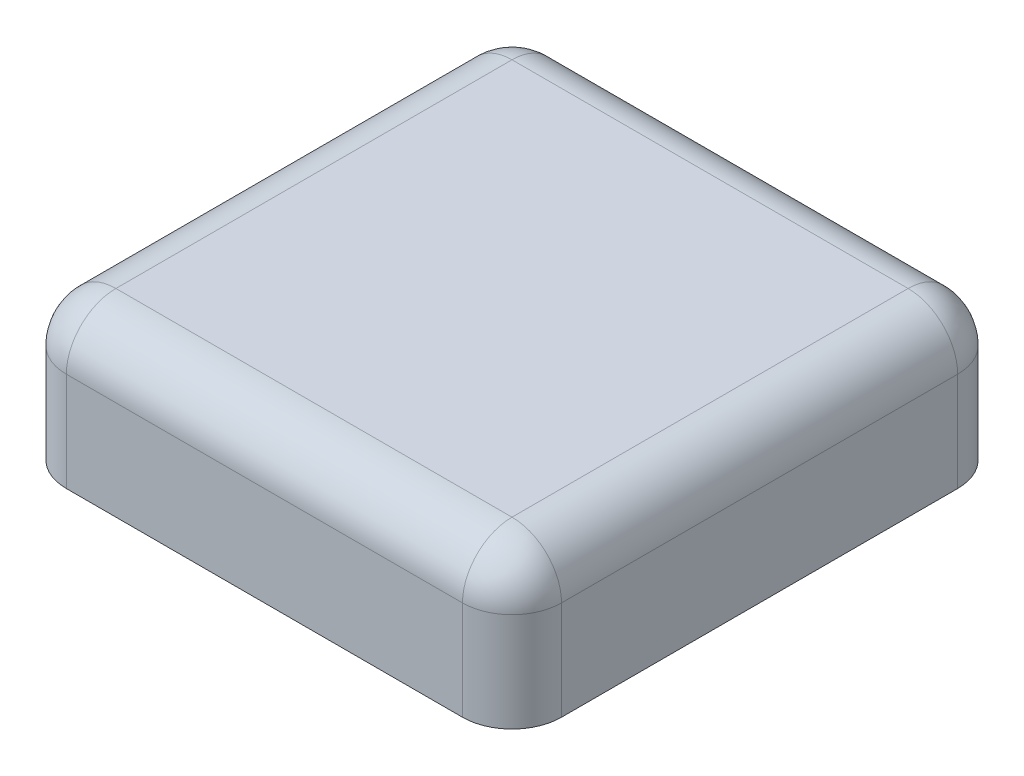
ISO-10303-21;
HEADER;
FILE_DESCRIPTION(('STEP AP214'),'2;1');
FILE_NAME('part.step','',(''),(''),'','','');
FILE_SCHEMA(('AUTOMOTIVE_DESIGN { 1 0 10303 214 1 1 1 1 }'));
ENDSEC;
DATA;
#1=APPLICATION_CONTEXT('core data for automotive mechanical design processes');
#2=APPLICATION_PROTOCOL_DEFINITION('international standard','automotive_design',2000,#1);
#3=PRODUCT_CONTEXT('',#1,'mechanical');
#4=PRODUCT('Part','Part','',(#3));
#5=PRODUCT_RELATED_PRODUCT_CATEGORY('part','',(#4));
#6=PRODUCT_DEFINITION_FORMATION('','',#4);
#7=PRODUCT_DEFINITION_CONTEXT('part definition',#1,'design');
#8=PRODUCT_DEFINITION('design','',#6,#7);
#9=PRODUCT_DEFINITION_SHAPE('','',#8);
#10=(LENGTH_UNIT() NAMED_UNIT(*) SI_UNIT(.MILLI.,.METRE.));
#11=(NAMED_UNIT(*) PLANE_ANGLE_UNIT() SI_UNIT($,.RADIAN.));
#12=(NAMED_UNIT(*) SI_UNIT($,.STERADIAN.) SOLID_ANGLE_UNIT());
#13=UNCERTAINTY_MEASURE_WITH_UNIT(LENGTH_MEASURE(1.E-05),#10,'distance_accuracy_value','');
#14=(GEOMETRIC_REPRESENTATION_CONTEXT(3) GLOBAL_UNCERTAINTY_ASSIGNED_CONTEXT((#13)) GLOBAL_UNIT_ASSIGNED_CONTEXT((#10,
#11,#12)) REPRESENTATION_CONTEXT('',''));
#15=CARTESIAN_POINT('',(0.,0.,0.));
#16=DIRECTION('',(0.,0.,1.));
#17=DIRECTION('',(1.,0.,0.));
#18=AXIS2_PLACEMENT_3D('',#15,#16,#17);
#19=CARTESIAN_POINT('',(122.19479133197,24.35696661282,0.45));
#20=DIRECTION('',(1.,4.371138828674E-08,0.));
#21=DIRECTION('',(-4.371138828674E-08,1.,0.));
#22=AXIS2_PLACEMENT_3D('',#19,#20,#21);
#23=SPHERICAL_SURFACE('',#22,0.05);
#24=CARTESIAN_POINT('',(122.19479133197,24.35696661282,0.45));
#25=DIRECTION('',(0.,0.,-1.));
#26=DIRECTION('',(-4.371138828674E-08,1.,0.));
#27=AXIS2_PLACEMENT_3D('',#24,#25,#26);
#28=CIRCLE('',#27,0.05);
#29=CARTESIAN_POINT('',(122.14479133197,24.356966610635,0.45));
#30=VERTEX_POINT('',#29);
#31=CARTESIAN_POINT('',(122.19479132978,24.40696661282,0.45));
#32=VERTEX_POINT('',#31);
#33=EDGE_CURVE('E11',#30,#32,#28,.T.);
#34=ORIENTED_EDGE('',*,*,#33,.F.);
#35=CARTESIAN_POINT('',(122.19479133197,24.35696661282,0.45));
#36=DIRECTION('',(-4.371138828674E-08,1.,0.));
#37=DIRECTION('',(0.,0.,1.));
#38=AXIS2_PLACEMENT_3D('',#35,#36,#37);
#39=CIRCLE('',#38,0.05);
#40=CARTESIAN_POINT('',(122.19479133197,24.35696661282,0.5));
#41=VERTEX_POINT('',#40);
#42=EDGE_CURVE('E196',#30,#41,#39,.T.);
#43=ORIENTED_EDGE('',*,*,#42,.T.);
#44=CARTESIAN_POINT('',(122.19479133197,24.35696661282,0.45));
#45=DIRECTION('',(1.,4.371138828674E-08,0.));
#46=DIRECTION('',(-4.371138828674E-08,1.,0.));
#47=AXIS2_PLACEMENT_3D('',#44,#45,#46);
#48=CIRCLE('',#47,0.05);
#49=EDGE_CURVE('E257',#32,#41,#48,.T.);
#50=ORIENTED_EDGE('',*,*,#49,.F.);
#51=EDGE_LOOP('',(#34,#43,#50));
#52=FACE_BOUND('',#51,.T.);
#53=ADVANCED_FACE('F16',(#52),#23,.T.);
#54=CARTESIAN_POINT('',(122.19479133197,24.35696661282,0.05));
#55=DIRECTION('',(0.,0.,1.));
#56=DIRECTION('',(-4.371138828674E-08,1.,0.));
#57=AXIS2_PLACEMENT_3D('',#54,#55,#56);
#58=SPHERICAL_SURFACE('',#57,0.05);
#59=CARTESIAN_POINT('',(122.19479133197,24.35696661282,0.05));
#60=DIRECTION('',(1.,4.371138828674E-08,0.));
#61=DIRECTION('',(-4.371138828674E-08,1.,0.));
#62=AXIS2_PLACEMENT_3D('',#59,#60,#61);
#63=CIRCLE('',#62,0.05);
#64=CARTESIAN_POINT('',(122.19479133197,24.35696661282,0.));
#65=VERTEX_POINT('',#64);
#66=CARTESIAN_POINT('',(122.19479132978,24.40696661282,0.05));
#67=VERTEX_POINT('',#66);
#68=EDGE_CURVE('E216',#65,#67,#63,.T.);
#69=ORIENTED_EDGE('',*,*,#68,.F.);
#70=CARTESIAN_POINT('',(122.19479133197,24.35696661282,0.05));
#71=DIRECTION('',(-4.371138822551E-08,1.,0.));
#72=DIRECTION('',(-1.,-4.371138822551E-08,0.));
#73=AXIS2_PLACEMENT_3D('',#70,#71,#72);
#74=CIRCLE('',#73,0.05);
#75=CARTESIAN_POINT('',(122.14479133197,24.356966610635,0.05));
#76=VERTEX_POINT('',#75);
#77=EDGE_CURVE('E20',#65,#76,#74,.T.);
#78=ORIENTED_EDGE('',*,*,#77,.T.);
#79=CARTESIAN_POINT('',(122.19479133197,24.35696661282,0.05));
#80=DIRECTION('',(0.,0.,1.));
#81=DIRECTION('',(-4.371138828674E-08,1.,0.));
#82=AXIS2_PLACEMENT_3D('',#79,#80,#81);
#83=CIRCLE('',#82,0.05);
#84=EDGE_CURVE('E27',#67,#76,#83,.T.);
#85=ORIENTED_EDGE('',*,*,#84,.F.);
#86=EDGE_LOOP('',(#69,#78,#85));
#87=FACE_BOUND('',#86,.T.);
#88=ADVANCED_FACE('F298',(#87),#58,.T.);
#89=CARTESIAN_POINT('',(122.19479133197,24.35696661282,0.));
#90=DIRECTION('',(0.,0.,1.));
#91=DIRECTION('',(-4.371138828674E-08,1.,0.));
#92=AXIS2_PLACEMENT_3D('',#89,#90,#91);
#93=CYLINDRICAL_SURFACE('',#92,0.05);
#94=DIRECTION('',(0.,0.,1.));
#95=VECTOR('',#94,1.);
#96=CARTESIAN_POINT('',(122.19479132978,24.40696661282,0.));
#97=LINE('',#96,#95);
#98=EDGE_CURVE('E178',#67,#32,#97,.T.);
#99=ORIENTED_EDGE('',*,*,#98,.F.);
#100=ORIENTED_EDGE('',*,*,#84,.T.);
#101=DIRECTION('',(0.,0.,1.));
#102=VECTOR('',#101,1.);
#103=CARTESIAN_POINT('',(122.14479133197,24.356966610635,0.));
#104=LINE('',#103,#102);
#105=EDGE_CURVE('E204',#76,#30,#104,.T.);
#106=ORIENTED_EDGE('',*,*,#105,.T.);
#107=ORIENTED_EDGE('',*,*,#33,.T.);
#108=EDGE_LOOP('',(#99,#100,#106,#107));
#109=FACE_BOUND('',#108,.T.);
#110=ADVANCED_FACE('F313',(#109),#93,.T.);
#111=CARTESIAN_POINT('',(122.64479133197,24.35696663249,0.45));
#112=DIRECTION('',(-1.,-4.371138828674E-08,0.));
#113=DIRECTION('',(-4.371138828674E-08,1.,0.));
#114=AXIS2_PLACEMENT_3D('',#111,#112,#113);
#115=CYLINDRICAL_SURFACE('',#114,0.05);
#116=DIRECTION('',(-1.,-4.371138828674E-08,0.));
#117=VECTOR('',#116,1.);
#118=CARTESIAN_POINT('',(122.64479132978,24.40696663249,0.45));
#119=LINE('',#118,#117);
#120=CARTESIAN_POINT('',(122.59479132978,24.406966630305,0.45));
#121=VERTEX_POINT('',#120);
#122=EDGE_CURVE('E226',#121,#32,#119,.T.);
#123=ORIENTED_EDGE('',*,*,#122,.T.);
#124=ORIENTED_EDGE('',*,*,#49,.T.);
#125=DIRECTION('',(-1.,-4.371138828674E-08,0.));
#126=VECTOR('',#125,1.);
#127=CARTESIAN_POINT('',(122.64479133197,24.35696663249,0.5));
#128=LINE('',#127,#126);
#129=CARTESIAN_POINT('',(122.59479133197,24.356966630305,0.5));
#130=VERTEX_POINT('',#129);
#131=EDGE_CURVE('E169',#130,#41,#128,.T.);
#132=ORIENTED_EDGE('',*,*,#131,.F.);
#133=CARTESIAN_POINT('',(122.59479133197,24.356966630305,0.45));
#134=DIRECTION('',(-1.,-4.371138828674E-08,0.));
#135=DIRECTION('',(-4.371138828674E-08,1.,0.));
#136=AXIS2_PLACEMENT_3D('',#133,#134,#135);
#137=CIRCLE('',#136,0.05);
#138=EDGE_CURVE('E229',#130,#121,#137,.T.);
#139=ORIENTED_EDGE('',*,*,#138,.T.);
#140=EDGE_LOOP('',(#123,#124,#132,#139));
#141=FACE_BOUND('',#140,.T.);
#142=ADVANCED_FACE('F304',(#141),#115,.T.);
#143=CARTESIAN_POINT('',(122.64479133197,24.35696663249,0.05));
#144=DIRECTION('',(-1.,-4.371138828674E-08,0.));
#145=DIRECTION('',(-4.371138828674E-08,1.,0.));
#146=AXIS2_PLACEMENT_3D('',#143,#144,#145);
#147=CYLINDRICAL_SURFACE('',#146,0.05);
#148=CARTESIAN_POINT('',(122.59479133197,24.356966630305,0.05));
#149=DIRECTION('',(1.,4.371138828674E-08,0.));
#150=DIRECTION('',(-4.371138828674E-08,1.,0.));
#151=AXIS2_PLACEMENT_3D('',#148,#149,#150);
#152=CIRCLE('',#151,0.05);
#153=CARTESIAN_POINT('',(122.59479133197,24.356966630305,0.));
#154=VERTEX_POINT('',#153);
#155=CARTESIAN_POINT('',(122.59479132978,24.406966630305,0.05));
#156=VERTEX_POINT('',#155);
#157=EDGE_CURVE('E134',#154,#156,#152,.T.);
#158=ORIENTED_EDGE('',*,*,#157,.F.);
#159=DIRECTION('',(-1.,-4.371138828674E-08,0.));
#160=VECTOR('',#159,1.);
#161=CARTESIAN_POINT('',(122.64479133197,24.35696663249,0.));
#162=LINE('',#161,#160);
#163=EDGE_CURVE('E140',#154,#65,#162,.T.);
#164=ORIENTED_EDGE('',*,*,#163,.T.);
#165=ORIENTED_EDGE('',*,*,#68,.T.);
#166=DIRECTION('',(-1.,-4.371138828674E-08,0.));
#167=VECTOR('',#166,1.);
#168=CARTESIAN_POINT('',(122.64479132978,24.40696663249,0.05));
#169=LINE('',#168,#167);
#170=EDGE_CURVE('E163',#156,#67,#169,.T.);
#171=ORIENTED_EDGE('',*,*,#170,.F.);
#172=EDGE_LOOP('',(#158,#164,#165,#171));
#173=FACE_BOUND('',#172,.T.);
#174=ADVANCED_FACE('F301',(#173),#147,.T.);
#175=CARTESIAN_POINT('',(122.14479137349,23.406966610635,0.));
#176=DIRECTION('',(-1.,-4.371138828674E-08,0.));
#177=DIRECTION('',(-4.371138828674E-08,1.,0.));
#178=AXIS2_PLACEMENT_3D('',#175,#176,#177);
#179=PLANE('',#178);
#180=DIRECTION('',(-4.371138828674E-08,1.,0.));
#181=VECTOR('',#180,1.);
#182=CARTESIAN_POINT('',(122.14479137349,23.406966610635,0.05));
#183=LINE('',#182,#181);
#184=CARTESIAN_POINT('',(122.14479133634,24.256966610635,0.05));
#185=VERTEX_POINT('',#184);
#186=EDGE_CURVE('E168',#185,#76,#183,.T.);
#187=ORIENTED_EDGE('',*,*,#186,.F.);
#188=DIRECTION('',(0.,0.,1.));
#189=VECTOR('',#188,1.);
#190=CARTESIAN_POINT('',(122.14479133634,24.256966610635,0.));
#191=LINE('',#190,#189);
#192=CARTESIAN_POINT('',(122.14479133634,24.256966610635,0.45));
#193=VERTEX_POINT('',#192);
#194=EDGE_CURVE('E175',#185,#193,#191,.T.);
#195=ORIENTED_EDGE('',*,*,#194,.T.);
#196=DIRECTION('',(-4.371138828674E-08,1.,0.));
#197=VECTOR('',#196,1.);
#198=CARTESIAN_POINT('',(122.14479137349,23.406966610635,0.45));
#199=LINE('',#198,#197);
#200=EDGE_CURVE('E188',#193,#30,#199,.T.);
#201=ORIENTED_EDGE('',*,*,#200,.T.);
#202=ORIENTED_EDGE('',*,*,#105,.F.);
#203=EDGE_LOOP('',(#187,#195,#201,#202));
#204=FACE_BOUND('',#203,.T.);
#205=ADVANCED_FACE('F303',(#204),#179,.T.);
#206=CARTESIAN_POINT('',(122.19479137349,23.40696661282,0.45));
#207=DIRECTION('',(-4.371138828674E-08,1.,0.));
#208=DIRECTION('',(-1.,-4.371138828674E-08,0.));
#209=AXIS2_PLACEMENT_3D('',#206,#207,#208);
#210=CYLINDRICAL_SURFACE('',#209,0.05);
#211=ORIENTED_EDGE('',*,*,#200,.F.);
#212=CARTESIAN_POINT('',(122.19479133634,24.25696661282,0.45));
#213=DIRECTION('',(-4.371138828674E-08,1.,0.));
#214=DIRECTION('',(-1.,-4.371138828674E-08,0.));
#215=AXIS2_PLACEMENT_3D('',#212,#213,#214);
#216=CIRCLE('',#215,0.05);
#217=CARTESIAN_POINT('',(122.19479133634,24.25696661282,0.5));
#218=VERTEX_POINT('',#217);
#219=EDGE_CURVE('E171',#193,#218,#216,.T.);
#220=ORIENTED_EDGE('',*,*,#219,.T.);
#221=DIRECTION('',(-4.371138828674E-08,1.,0.));
#222=VECTOR('',#221,1.);
#223=CARTESIAN_POINT('',(122.19479137349,23.40696661282,0.5));
#224=LINE('',#223,#222);
#225=EDGE_CURVE('E165',#218,#41,#224,.T.);
#226=ORIENTED_EDGE('',*,*,#225,.T.);
#227=ORIENTED_EDGE('',*,*,#42,.F.);
#228=EDGE_LOOP('',(#211,#220,#226,#227));
#229=FACE_BOUND('',#228,.T.);
#230=ADVANCED_FACE('F311',(#229),#210,.T.);
#231=CARTESIAN_POINT('',(122.19479137349,23.40696661282,0.05));
#232=DIRECTION('',(-4.371138828674E-08,1.,0.));
#233=DIRECTION('',(-1.,-4.371138828674E-08,0.));
#234=AXIS2_PLACEMENT_3D('',#231,#232,#233);
#235=CYLINDRICAL_SURFACE('',#234,0.05);
#236=ORIENTED_EDGE('',*,*,#186,.T.);
#237=ORIENTED_EDGE('',*,*,#77,.F.);
#238=DIRECTION('',(-4.371138828674E-08,1.,0.));
#239=VECTOR('',#238,1.);
#240=CARTESIAN_POINT('',(122.19479137349,23.40696661282,0.));
#241=LINE('',#240,#239);
#242=CARTESIAN_POINT('',(122.19479133634,24.25696661282,0.));
#243=VERTEX_POINT('',#242);
#244=EDGE_CURVE('E164',#243,#65,#241,.T.);
#245=ORIENTED_EDGE('',*,*,#244,.F.);
#246=CARTESIAN_POINT('',(122.19479133634,24.25696661282,0.05));
#247=DIRECTION('',(-4.371138828674E-08,1.,0.));
#248=DIRECTION('',(-1.,-4.371138828674E-08,0.));
#249=AXIS2_PLACEMENT_3D('',#246,#247,#248);
#250=CIRCLE('',#249,0.05);
#251=EDGE_CURVE('E130',#243,#185,#250,.T.);
#252=ORIENTED_EDGE('',*,*,#251,.T.);
#253=EDGE_LOOP('',(#236,#237,#245,#252));
#254=FACE_BOUND('',#253,.T.);
#255=ADVANCED_FACE('F300',(#254),#235,.T.);
#256=CARTESIAN_POINT('',(122.64479137349,23.40696663249,0.5));
#257=DIRECTION('',(0.,0.,1.));
#258=DIRECTION('',(1.,0.,0.));
#259=AXIS2_PLACEMENT_3D('',#256,#257,#258);
#260=PLANE('',#259);
#261=DIRECTION('',(-1.,-4.371138828674E-08,0.));
#262=VECTOR('',#261,1.);
#263=CARTESIAN_POINT('',(122.64479133634,24.25696663249,0.5));
#264=LINE('',#263,#262);
#265=CARTESIAN_POINT('',(122.59479133634,24.256966630305,0.5));
#266=VERTEX_POINT('',#265);
#267=EDGE_CURVE('E160',#266,#218,#264,.T.);
#268=ORIENTED_EDGE('',*,*,#267,.F.);
#269=DIRECTION('',(-4.371138828674E-08,1.,0.));
#270=VECTOR('',#269,1.);
#271=CARTESIAN_POINT('',(122.59479137349,23.406966630305,0.5));
#272=LINE('',#271,#270);
#273=EDGE_CURVE('E209',#266,#130,#272,.T.);
#274=ORIENTED_EDGE('',*,*,#273,.T.);
#275=ORIENTED_EDGE('',*,*,#131,.T.);
#276=ORIENTED_EDGE('',*,*,#225,.F.);
#277=EDGE_LOOP('',(#268,#274,#275,#276));
#278=FACE_BOUND('',#277,.T.);
#279=ADVANCED_FACE('F18',(#278),#260,.T.);
#280=CARTESIAN_POINT('',(122.59479133197,24.356966630305,0.45));
#281=DIRECTION('',(0.,0.,-1.));
#282=DIRECTION('',(-4.371138828674E-08,1.,0.));
#283=AXIS2_PLACEMENT_3D('',#280,#281,#282);
#284=SPHERICAL_SURFACE('',#283,0.05);
#285=ORIENTED_EDGE('',*,*,#138,.F.);
#286=CARTESIAN_POINT('',(122.59479133197,24.356966630305,0.45));
#287=DIRECTION('',(-4.371138834797E-08,1.,0.));
#288=DIRECTION('',(1.,4.371138834797E-08,0.));
#289=AXIS2_PLACEMENT_3D('',#286,#287,#288);
#290=CIRCLE('',#289,0.05);
#291=CARTESIAN_POINT('',(122.64479133197,24.35696663249,0.45));
#292=VERTEX_POINT('',#291);
#293=EDGE_CURVE('E64',#130,#292,#290,.T.);
#294=ORIENTED_EDGE('',*,*,#293,.T.);
#295=CARTESIAN_POINT('',(122.59479133197,24.356966630305,0.45));
#296=DIRECTION('',(0.,0.,-1.));
#297=DIRECTION('',(-4.371138828674E-08,1.,0.));
#298=AXIS2_PLACEMENT_3D('',#295,#296,#297);
#299=CIRCLE('',#298,0.05);
#300=EDGE_CURVE('E241',#121,#292,#299,.T.);
#301=ORIENTED_EDGE('',*,*,#300,.F.);
#302=EDGE_LOOP('',(#285,#294,#301));
#303=FACE_BOUND('',#302,.T.);
#304=ADVANCED_FACE('F325',(#303),#284,.T.);
#305=CARTESIAN_POINT('',(122.64479132978,24.40696663249,0.));
#306=DIRECTION('',(-4.371138828674E-08,1.,0.));
#307=DIRECTION('',(0.,0.,1.));
#308=AXIS2_PLACEMENT_3D('',#305,#306,#307);
#309=PLANE('',#308);
#310=DIRECTION('',(0.,0.,1.));
#311=VECTOR('',#310,1.);
#312=CARTESIAN_POINT('',(122.59479132978,24.406966630305,0.));
#313=LINE('',#312,#311);
#314=EDGE_CURVE('E244',#156,#121,#313,.T.);
#315=ORIENTED_EDGE('',*,*,#314,.F.);
#316=ORIENTED_EDGE('',*,*,#170,.T.);
#317=ORIENTED_EDGE('',*,*,#98,.T.);
#318=ORIENTED_EDGE('',*,*,#122,.F.);
#319=EDGE_LOOP('',(#315,#316,#317,#318));
#320=FACE_BOUND('',#319,.T.);
#321=ADVANCED_FACE('F275',(#320),#309,.T.);
#322=CARTESIAN_POINT('',(122.64479137349,23.40696663249,0.));
#323=DIRECTION('',(0.,0.,1.));
#324=DIRECTION('',(1.,0.,0.));
#325=AXIS2_PLACEMENT_3D('',#322,#323,#324);
#326=PLANE('',#325);
#327=ORIENTED_EDGE('',*,*,#244,.T.);
#328=ORIENTED_EDGE('',*,*,#163,.F.);
#329=DIRECTION('',(-4.371138828674E-08,1.,0.));
#330=VECTOR('',#329,1.);
#331=CARTESIAN_POINT('',(122.59479137349,23.406966630305,0.));
#332=LINE('',#331,#330);
#333=CARTESIAN_POINT('',(122.59479133634,24.256966630305,0.));
#334=VERTEX_POINT('',#333);
#335=EDGE_CURVE('E137',#334,#154,#332,.T.);
#336=ORIENTED_EDGE('',*,*,#335,.F.);
#337=DIRECTION('',(-1.,-4.371138828674E-08,0.));
#338=VECTOR('',#337,1.);
#339=CARTESIAN_POINT('',(122.64479133634,24.25696663249,0.));
#340=LINE('',#339,#338);
#341=EDGE_CURVE('E120',#334,#243,#340,.T.);
#342=ORIENTED_EDGE('',*,*,#341,.T.);
#343=EDGE_LOOP('',(#327,#328,#336,#342));
#344=FACE_BOUND('',#343,.T.);
#345=ADVANCED_FACE('F138',(#344),#326,.F.);
#346=CARTESIAN_POINT('',(122.59479133197,24.356966630305,0.05));
#347=DIRECTION('',(0.,0.,1.));
#348=DIRECTION('',(-4.371138828674E-08,1.,0.));
#349=AXIS2_PLACEMENT_3D('',#346,#347,#348);
#350=SPHERICAL_SURFACE('',#349,0.05);
#351=CARTESIAN_POINT('',(122.59479133197,24.356966630305,0.05));
#352=DIRECTION('',(0.,0.,-1.));
#353=DIRECTION('',(-4.371138828674E-08,1.,0.));
#354=AXIS2_PLACEMENT_3D('',#351,#352,#353);
#355=CIRCLE('',#354,0.05);
#356=CARTESIAN_POINT('',(122.64479133197,24.35696663249,0.05));
#357=VERTEX_POINT('',#356);
#358=EDGE_CURVE('E79',#156,#357,#355,.T.);
#359=ORIENTED_EDGE('',*,*,#358,.T.);
#360=CARTESIAN_POINT('',(122.59479133197,24.356966630305,0.05));
#361=DIRECTION('',(4.371138834797E-08,-1.,0.));
#362=DIRECTION('',(1.,4.371138834797E-08,0.));
#363=AXIS2_PLACEMENT_3D('',#360,#361,#362);
#364=CIRCLE('',#363,0.05);
#365=EDGE_CURVE('E144',#154,#357,#364,.T.);
#366=ORIENTED_EDGE('',*,*,#365,.F.);
#367=ORIENTED_EDGE('',*,*,#157,.T.);
#368=EDGE_LOOP('',(#359,#366,#367));
#369=FACE_BOUND('',#368,.T.);
#370=ADVANCED_FACE('F271',(#369),#350,.T.);
#371=CARTESIAN_POINT('',(122.64479133634,24.25696663249,0.));
#372=DIRECTION('',(-4.371138828674E-08,1.,0.));
#373=DIRECTION('',(0.,0.,1.));
#374=AXIS2_PLACEMENT_3D('',#371,#372,#373);
#375=PLANE('',#374);
#376=CARTESIAN_POINT('',(122.59479133634,24.256966630305,0.45));
#377=DIRECTION('',(-4.371138828674E-08,1.,0.));
#378=DIRECTION('',(1.,4.371138828674E-08,0.));
#379=AXIS2_PLACEMENT_3D('',#376,#377,#378);
#380=CIRCLE('',#379,0.05);
#381=CARTESIAN_POINT('',(122.64479133634,24.25696663249,0.45));
#382=VERTEX_POINT('',#381);
#383=EDGE_CURVE('E213',#266,#382,#380,.T.);
#384=ORIENTED_EDGE('',*,*,#383,.F.);
#385=ORIENTED_EDGE('',*,*,#267,.T.);
#386=ORIENTED_EDGE('',*,*,#219,.F.);
#387=ORIENTED_EDGE('',*,*,#194,.F.);
#388=ORIENTED_EDGE('',*,*,#251,.F.);
#389=ORIENTED_EDGE('',*,*,#341,.F.);
#390=CARTESIAN_POINT('',(122.59479133634,24.256966630305,0.05));
#391=DIRECTION('',(-4.371138828674E-08,1.,0.));
#392=DIRECTION('',(1.,4.371138828674E-08,0.));
#393=AXIS2_PLACEMENT_3D('',#390,#391,#392);
#394=CIRCLE('',#393,0.05);
#395=CARTESIAN_POINT('',(122.64479133634,24.25696663249,0.05));
#396=VERTEX_POINT('',#395);
#397=EDGE_CURVE('E126',#396,#334,#394,.T.);
#398=ORIENTED_EDGE('',*,*,#397,.F.);
#399=DIRECTION('',(0.,0.,1.));
#400=VECTOR('',#399,1.);
#401=CARTESIAN_POINT('',(122.64479133634,24.25696663249,0.));
#402=LINE('',#401,#400);
#403=EDGE_CURVE('E156',#396,#382,#402,.T.);
#404=ORIENTED_EDGE('',*,*,#403,.T.);
#405=EDGE_LOOP('',(#384,#385,#386,#387,#388,#389,#398,#404));
#406=FACE_BOUND('',#405,.T.);
#407=ADVANCED_FACE('F123',(#406),#375,.F.);
#408=CARTESIAN_POINT('',(122.59479137349,23.406966630305,0.45));
#409=DIRECTION('',(-4.371138828674E-08,1.,0.));
#410=DIRECTION('',(1.,4.371138828674E-08,0.));
#411=AXIS2_PLACEMENT_3D('',#408,#409,#410);
#412=CYLINDRICAL_SURFACE('',#411,0.05);
#413=DIRECTION('',(-4.371138828674E-08,1.,0.));
#414=VECTOR('',#413,1.);
#415=CARTESIAN_POINT('',(122.64479137349,23.40696663249,0.45));
#416=LINE('',#415,#414);
#417=EDGE_CURVE('E236',#382,#292,#416,.T.);
#418=ORIENTED_EDGE('',*,*,#417,.T.);
#419=ORIENTED_EDGE('',*,*,#293,.F.);
#420=ORIENTED_EDGE('',*,*,#273,.F.);
#421=ORIENTED_EDGE('',*,*,#383,.T.);
#422=EDGE_LOOP('',(#418,#419,#420,#421));
#423=FACE_BOUND('',#422,.T.);
#424=ADVANCED_FACE('F286',(#423),#412,.T.);
#425=CARTESIAN_POINT('',(122.59479133197,24.356966630305,0.));
#426=DIRECTION('',(0.,0.,1.));
#427=DIRECTION('',(-4.371138828674E-08,1.,0.));
#428=AXIS2_PLACEMENT_3D('',#425,#426,#427);
#429=CYLINDRICAL_SURFACE('',#428,0.05);
#430=ORIENTED_EDGE('',*,*,#300,.T.);
#431=DIRECTION('',(0.,0.,1.));
#432=VECTOR('',#431,1.);
#433=CARTESIAN_POINT('',(122.64479133197,24.35696663249,0.));
#434=LINE('',#433,#432);
#435=EDGE_CURVE('E240',#357,#292,#434,.T.);
#436=ORIENTED_EDGE('',*,*,#435,.F.);
#437=ORIENTED_EDGE('',*,*,#358,.F.);
#438=ORIENTED_EDGE('',*,*,#314,.T.);
#439=EDGE_LOOP('',(#430,#436,#437,#438));
#440=FACE_BOUND('',#439,.T.);
#441=ADVANCED_FACE('F278',(#440),#429,.T.);
#442=CARTESIAN_POINT('',(122.59479137349,23.406966630305,0.05));
#443=DIRECTION('',(-4.371138828674E-08,1.,0.));
#444=DIRECTION('',(1.,4.371138828674E-08,0.));
#445=AXIS2_PLACEMENT_3D('',#442,#443,#444);
#446=CYLINDRICAL_SURFACE('',#445,0.05);
#447=ORIENTED_EDGE('',*,*,#397,.T.);
#448=ORIENTED_EDGE('',*,*,#335,.T.);
#449=ORIENTED_EDGE('',*,*,#365,.T.);
#450=DIRECTION('',(-4.371138828674E-08,1.,0.));
#451=VECTOR('',#450,1.);
#452=CARTESIAN_POINT('',(122.64479137349,23.40696663249,0.05));
#453=LINE('',#452,#451);
#454=EDGE_CURVE('E148',#396,#357,#453,.T.);
#455=ORIENTED_EDGE('',*,*,#454,.F.);
#456=EDGE_LOOP('',(#447,#448,#449,#455));
#457=FACE_BOUND('',#456,.T.);
#458=ADVANCED_FACE('F146',(#457),#446,.T.);
#459=CARTESIAN_POINT('',(122.64479137349,23.40696663249,0.));
#460=DIRECTION('',(-1.,-4.371138828674E-08,0.));
#461=DIRECTION('',(-4.371138828674E-08,1.,0.));
#462=AXIS2_PLACEMENT_3D('',#459,#460,#461);
#463=PLANE('',#462);
#464=ORIENTED_EDGE('',*,*,#435,.T.);
#465=ORIENTED_EDGE('',*,*,#417,.F.);
#466=ORIENTED_EDGE('',*,*,#403,.F.);
#467=ORIENTED_EDGE('',*,*,#454,.T.);
#468=EDGE_LOOP('',(#464,#465,#466,#467));
#469=FACE_BOUND('',#468,.T.);
#470=ADVANCED_FACE('F281',(#469),#463,.F.);
#471=CLOSED_SHELL('',(#53,#88,#110,#142,#174,#205,#230,#255,#279,#304,#321,#345,#370,#407,#424,
#441,#458,#470));
#472=MANIFOLD_SOLID_BREP('B1',#471);
#473=ADVANCED_BREP_SHAPE_REPRESENTATION('',(#18,#472),#14);
#474=SHAPE_DEFINITION_REPRESENTATION(#9,#473);
ENDSEC;
END-ISO-10303-21;
